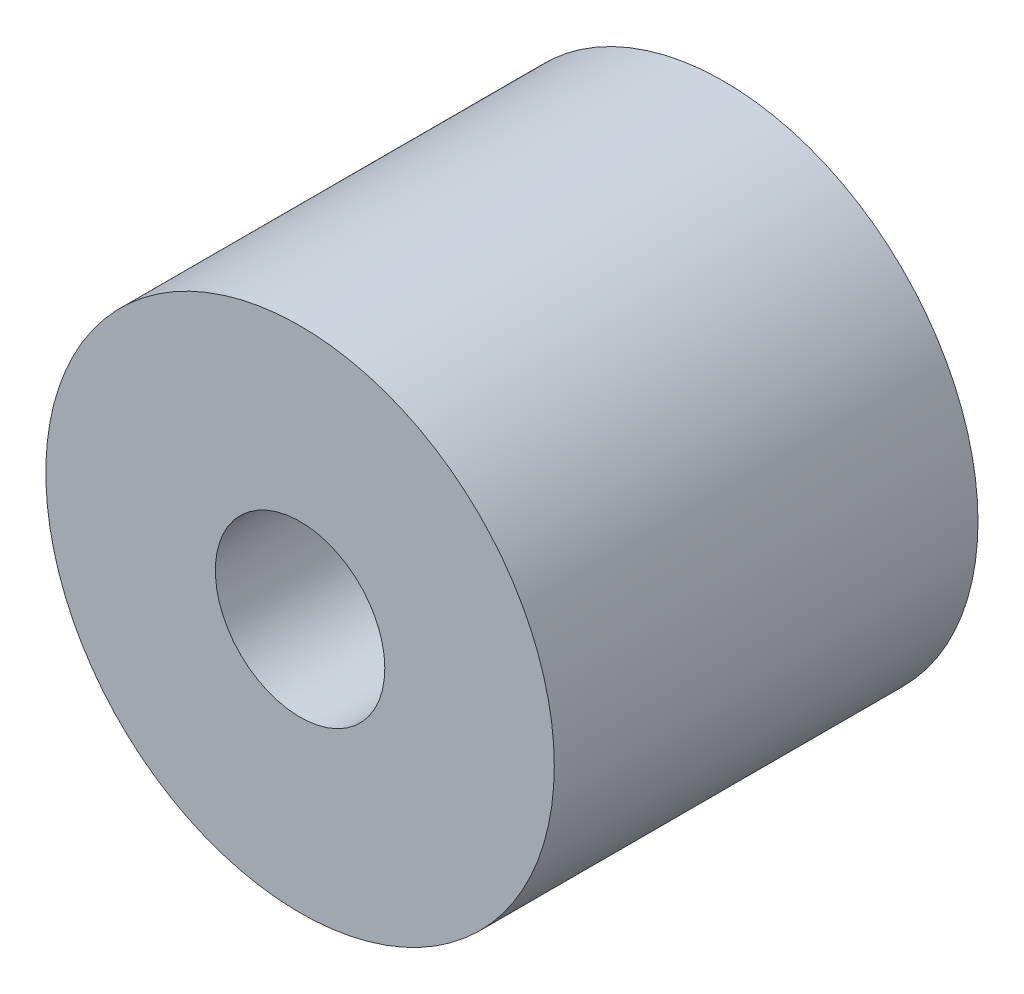
ISO-10303-21;
HEADER;
FILE_DESCRIPTION(('STEP AP214'),'2;1');
FILE_NAME('part.step','',(''),(''),'','','');
FILE_SCHEMA(('AUTOMOTIVE_DESIGN { 1 0 10303 214 1 1 1 1 }'));
ENDSEC;
DATA;
#1=APPLICATION_CONTEXT('core data for automotive mechanical design processes');
#2=APPLICATION_PROTOCOL_DEFINITION('international standard','automotive_design',2000,#1);
#3=PRODUCT_CONTEXT('',#1,'mechanical');
#4=PRODUCT('Part','Part','',(#3));
#5=PRODUCT_RELATED_PRODUCT_CATEGORY('part','',(#4));
#6=PRODUCT_DEFINITION_FORMATION('','',#4);
#7=PRODUCT_DEFINITION_CONTEXT('part definition',#1,'design');
#8=PRODUCT_DEFINITION('design','',#6,#7);
#9=PRODUCT_DEFINITION_SHAPE('','',#8);
#10=(LENGTH_UNIT() NAMED_UNIT(*) SI_UNIT(.MILLI.,.METRE.));
#11=(NAMED_UNIT(*) PLANE_ANGLE_UNIT() SI_UNIT($,.RADIAN.));
#12=(NAMED_UNIT(*) SI_UNIT($,.STERADIAN.) SOLID_ANGLE_UNIT());
#13=UNCERTAINTY_MEASURE_WITH_UNIT(LENGTH_MEASURE(1.E-05),#10,'distance_accuracy_value','');
#14=(GEOMETRIC_REPRESENTATION_CONTEXT(3) GLOBAL_UNCERTAINTY_ASSIGNED_CONTEXT((#13)) GLOBAL_UNIT_ASSIGNED_CONTEXT((#10,
#11,#12)) REPRESENTATION_CONTEXT('',''));
#15=CARTESIAN_POINT('',(0.,0.,0.));
#16=DIRECTION('',(0.,0.,1.));
#17=DIRECTION('',(1.,0.,0.));
#18=AXIS2_PLACEMENT_3D('',#15,#16,#17);
#19=CARTESIAN_POINT('',(0.,0.,5.));
#20=DIRECTION('',(0.,0.,-1.));
#21=DIRECTION('',(-1.,0.,0.));
#22=AXIS2_PLACEMENT_3D('',#19,#20,#21);
#23=CYLINDRICAL_SURFACE('',#22,3.);
#24=CARTESIAN_POINT('',(0.,0.,5.));
#25=DIRECTION('',(0.,0.,1.));
#26=DIRECTION('',(1.,0.,0.));
#27=AXIS2_PLACEMENT_3D('',#24,#25,#26);
#28=CIRCLE('',#27,3.);
#29=CARTESIAN_POINT('',(3.,0.,5.));
#30=VERTEX_POINT('',#29);
#31=EDGE_CURVE('E10',#30,#30,#28,.T.);
#32=ORIENTED_EDGE('',*,*,#31,.F.);
#33=EDGE_LOOP('',(#32));
#34=FACE_BOUND('',#33,.T.);
#35=CARTESIAN_POINT('',(0.,0.,0.));
#36=DIRECTION('',(0.,0.,1.));
#37=DIRECTION('',(1.,0.,0.));
#38=AXIS2_PLACEMENT_3D('',#35,#36,#37);
#39=CIRCLE('',#38,3.);
#40=CARTESIAN_POINT('',(3.,0.,0.));
#41=VERTEX_POINT('',#40);
#42=EDGE_CURVE('E36',#41,#41,#39,.T.);
#43=ORIENTED_EDGE('',*,*,#42,.T.);
#44=EDGE_LOOP('',(#43));
#45=FACE_BOUND('',#44,.T.);
#46=ADVANCED_FACE('F33',(#34,#45),#23,.T.);
#47=CARTESIAN_POINT('',(0.,0.,5.));
#48=DIRECTION('',(0.,0.,1.));
#49=DIRECTION('',(1.,0.,0.));
#50=AXIS2_PLACEMENT_3D('',#47,#48,#49);
#51=PLANE('',#50);
#52=CARTESIAN_POINT('',(0.,0.,5.));
#53=DIRECTION('',(0.,0.,1.));
#54=DIRECTION('',(1.,0.,0.));
#55=AXIS2_PLACEMENT_3D('',#52,#53,#54);
#56=CIRCLE('',#55,1.);
#57=CARTESIAN_POINT('',(1.,0.,5.));
#58=VERTEX_POINT('',#57);
#59=EDGE_CURVE('E45',#58,#58,#56,.T.);
#60=ORIENTED_EDGE('',*,*,#59,.F.);
#61=EDGE_LOOP('',(#60));
#62=FACE_BOUND('',#61,.T.);
#63=ORIENTED_EDGE('',*,*,#31,.T.);
#64=EDGE_LOOP('',(#63));
#65=FACE_BOUND('',#64,.T.);
#66=ADVANCED_FACE('F60',(#62,#65),#51,.T.);
#67=CARTESIAN_POINT('',(0.,0.,0.));
#68=DIRECTION('',(0.,0.,1.));
#69=DIRECTION('',(1.,0.,0.));
#70=AXIS2_PLACEMENT_3D('',#67,#68,#69);
#71=PLANE('',#70);
#72=CARTESIAN_POINT('',(0.,0.,0.));
#73=DIRECTION('',(0.,0.,1.));
#74=DIRECTION('',(1.,0.,0.));
#75=AXIS2_PLACEMENT_3D('',#72,#73,#74);
#76=CIRCLE('',#75,1.);
#77=CARTESIAN_POINT('',(1.,0.,0.));
#78=VERTEX_POINT('',#77);
#79=EDGE_CURVE('E43',#78,#78,#76,.T.);
#80=ORIENTED_EDGE('',*,*,#79,.T.);
#81=EDGE_LOOP('',(#80));
#82=FACE_BOUND('',#81,.T.);
#83=ORIENTED_EDGE('',*,*,#42,.F.);
#84=EDGE_LOOP('',(#83));
#85=FACE_BOUND('',#84,.T.);
#86=ADVANCED_FACE('F51',(#82,#85),#71,.F.);
#87=CARTESIAN_POINT('',(0.,0.,0.));
#88=DIRECTION('',(0.,0.,1.));
#89=DIRECTION('',(1.,0.,0.));
#90=AXIS2_PLACEMENT_3D('',#87,#88,#89);
#91=CYLINDRICAL_SURFACE('',#90,1.);
#92=ORIENTED_EDGE('',*,*,#79,.F.);
#93=EDGE_LOOP('',(#92));
#94=FACE_BOUND('',#93,.T.);
#95=ORIENTED_EDGE('',*,*,#59,.T.);
#96=EDGE_LOOP('',(#95));
#97=FACE_BOUND('',#96,.T.);
#98=ADVANCED_FACE('F54',(#94,#97),#91,.F.);
#99=CLOSED_SHELL('',(#46,#66,#86,#98));
#100=MANIFOLD_SOLID_BREP('B2',#99);
#101=ADVANCED_BREP_SHAPE_REPRESENTATION('',(#18,#100),#14);
#102=SHAPE_DEFINITION_REPRESENTATION(#9,#101);
ENDSEC;
END-ISO-10303-21;
